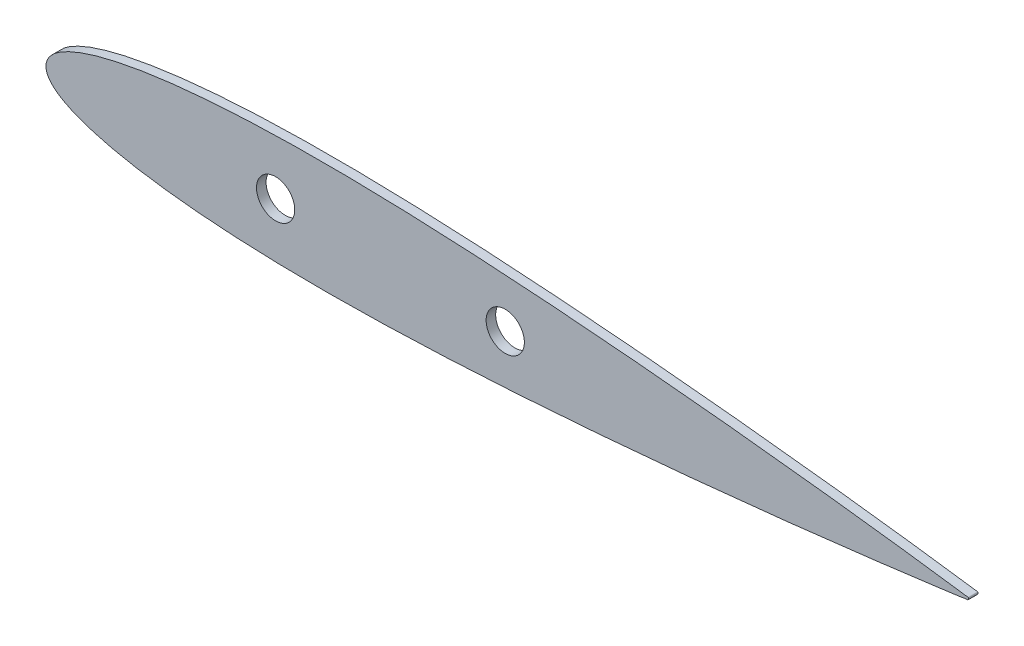
ISO-10303-21;
HEADER;
FILE_DESCRIPTION(('STEP AP214'),'2;1');
FILE_NAME('part.step','',(''),(''),'','','');
FILE_SCHEMA(('AUTOMOTIVE_DESIGN { 1 0 10303 214 1 1 1 1 }'));
ENDSEC;
DATA;
#1=APPLICATION_CONTEXT('core data for automotive mechanical design processes');
#2=APPLICATION_PROTOCOL_DEFINITION('international standard','automotive_design',2000,#1);
#3=PRODUCT_CONTEXT('',#1,'mechanical');
#4=PRODUCT('Part','Part','',(#3));
#5=PRODUCT_RELATED_PRODUCT_CATEGORY('part','',(#4));
#6=PRODUCT_DEFINITION_FORMATION('','',#4);
#7=PRODUCT_DEFINITION_CONTEXT('part definition',#1,'design');
#8=PRODUCT_DEFINITION('design','',#6,#7);
#9=PRODUCT_DEFINITION_SHAPE('','',#8);
#10=(LENGTH_UNIT() NAMED_UNIT(*) SI_UNIT(.MILLI.,.METRE.));
#11=(NAMED_UNIT(*) PLANE_ANGLE_UNIT() SI_UNIT($,.RADIAN.));
#12=(NAMED_UNIT(*) SI_UNIT($,.STERADIAN.) SOLID_ANGLE_UNIT());
#13=UNCERTAINTY_MEASURE_WITH_UNIT(LENGTH_MEASURE(1.E-05),#10,'distance_accuracy_value','');
#14=(GEOMETRIC_REPRESENTATION_CONTEXT(3) GLOBAL_UNCERTAINTY_ASSIGNED_CONTEXT((#13)) GLOBAL_UNIT_ASSIGNED_CONTEXT((#10,
#11,#12)) REPRESENTATION_CONTEXT('',''));
#15=CARTESIAN_POINT('',(0.,0.,0.));
#16=DIRECTION('',(0.,0.,1.));
#17=DIRECTION('',(1.,0.,0.));
#18=AXIS2_PLACEMENT_3D('',#15,#16,#17);
#19=CARTESIAN_POINT('',(305.9684,0.385520184,-3.175));
#20=CARTESIAN_POINT('',(305.854824007575,0.48069841410973,-3.175));
#21=CARTESIAN_POINT('',(305.120994555895,0.390831673606597,-3.175));
#22=CARTESIAN_POINT('',(303.814231768042,0.758686679799253,-3.175));
#23=CARTESIAN_POINT('',(301.417802676736,0.986054669025246,-3.175));
#24=CARTESIAN_POINT('',(298.189448712779,1.47401427677621,-3.175));
#25=CARTESIAN_POINT('',(294.030845174513,2.01854457527572,-3.175));
#26=CARTESIAN_POINT('',(289.015831822483,2.68965318276561,-3.175));
#27=CARTESIAN_POINT('',(283.157456272631,3.44827766150184,-3.175));
#28=CARTESIAN_POINT('',(276.49814160148,4.29290770175638,-3.175));
#29=CARTESIAN_POINT('',(269.076807577243,5.20874671807568,-3.175));
#30=CARTESIAN_POINT('',(260.939879406817,6.18340018350213,-3.175));
#31=CARTESIAN_POINT('',(252.137372075434,7.20477952206095,-3.175));
#32=CARTESIAN_POINT('',(242.723491759647,8.25897893790445,-3.175));
#33=CARTESIAN_POINT('',(232.756311129561,9.33312748999758,-3.175));
#34=CARTESIAN_POINT('',(222.297351640593,10.4138841228529,-3.175));
#35=CARTESIAN_POINT('',(211.411070811173,11.4872989231079,-3.175));
#36=CARTESIAN_POINT('',(200.164615863161,12.538304371789,-3.175));
#37=CARTESIAN_POINT('',(188.627247338619,13.5531029361085,-3.175));
#38=CARTESIAN_POINT('',(176.87022307814,14.514729000407,-3.175));
#39=CARTESIAN_POINT('',(164.965784853564,15.4075032133192,-3.175));
#40=CARTESIAN_POINT('',(152.987435637631,16.2148505092547,-3.175));
#41=CARTESIAN_POINT('',(141.008978817888,16.9198899528314,-3.175));
#42=CARTESIAN_POINT('',(129.104156498311,17.5048096113218,-3.175));
#43=CARTESIAN_POINT('',(117.346492481379,17.9540120579031,-3.175));
#44=CARTESIAN_POINT('',(105.808137483863,18.2528426223714,-3.175));
#45=CARTESIAN_POINT('',(94.5603961851285,18.386705288232,-3.175));
#46=CARTESIAN_POINT('',(83.6723813017294,18.3449766577127,-3.175));
#47=CARTESIAN_POINT('',(73.211220284293,18.1195965084667,-3.175));
#48=CARTESIAN_POINT('',(63.2413063542083,17.7048517000977,-3.175));
#49=CARTESIAN_POINT('',(53.8240062425347,17.0996573248404,-3.175));
#50=CARTESIAN_POINT('',(45.0171990186773,16.3058343725863,-3.175));
#51=CARTESIAN_POINT('',(36.8747760736251,15.3295826346004,-3.175));
#52=CARTESIAN_POINT('',(29.4463680844939,14.1792085683293,-3.175));
#53=CARTESIAN_POINT('',(22.7769894068164,12.8667268476887,-3.175));
#54=CARTESIAN_POINT('',(16.9057301867433,11.4069780538882,-3.175));
#55=CARTESIAN_POINT('',(11.8659534663283,9.8141965580124,-3.175));
#56=CARTESIAN_POINT('',(7.68326461790974,8.10321690756641,-3.175));
#57=CARTESIAN_POINT('',(4.37100235259373,6.28561468423618,-3.175));
#58=CARTESIAN_POINT('',(1.93426345252676,4.35780250182331,-3.175));
#59=CARTESIAN_POINT('',(0.373552012235147,2.27314220301764,-3.175));
#60=CARTESIAN_POINT('',(-0.17408851908788,0.,-3.175));
#61=CARTESIAN_POINT('',(0.37355201223512,-2.27314220301757,-3.175));
#62=CARTESIAN_POINT('',(1.9342634525268,-4.35780250182338,-3.175));
#63=CARTESIAN_POINT('',(4.37100235259372,-6.28561468423617,-3.175));
#64=CARTESIAN_POINT('',(7.6832646179097,-8.10321690756639,-3.175));
#65=CARTESIAN_POINT('',(11.8659534663283,-9.81419655801241,-3.175));
#66=CARTESIAN_POINT('',(16.9057301867433,-11.4069780538882,-3.175));
#67=CARTESIAN_POINT('',(22.7769894068164,-12.8667268476887,-3.175));
#68=CARTESIAN_POINT('',(29.4463680844939,-14.1792085683293,-3.175));
#69=CARTESIAN_POINT('',(36.8747760736251,-15.3295826346004,-3.175));
#70=CARTESIAN_POINT('',(45.0171990186774,-16.3058343725863,-3.175));
#71=CARTESIAN_POINT('',(53.8240062425346,-17.0996573248404,-3.175));
#72=CARTESIAN_POINT('',(63.2413063542084,-17.7048517000977,-3.175));
#73=CARTESIAN_POINT('',(73.211220284293,-18.1195965084667,-3.175));
#74=CARTESIAN_POINT('',(83.6723813017294,-18.3449766577127,-3.175));
#75=CARTESIAN_POINT('',(94.5603961851285,-18.386705288232,-3.175));
#76=CARTESIAN_POINT('',(105.808137483863,-18.2528426223714,-3.175));
#77=CARTESIAN_POINT('',(117.346492481379,-17.9540120579031,-3.175));
#78=CARTESIAN_POINT('',(129.104156498311,-17.5048096113217,-3.175));
#79=CARTESIAN_POINT('',(141.008978817888,-16.9198899528313,-3.175));
#80=CARTESIAN_POINT('',(152.987435637631,-16.2148505092547,-3.175));
#81=CARTESIAN_POINT('',(164.965784853564,-15.4075032133192,-3.175));
#82=CARTESIAN_POINT('',(176.87022307814,-14.514729000407,-3.175));
#83=CARTESIAN_POINT('',(188.627247338619,-13.5531029361085,-3.175));
#84=CARTESIAN_POINT('',(200.164615863161,-12.538304371789,-3.175));
#85=CARTESIAN_POINT('',(211.411070811174,-11.4872989231079,-3.175));
#86=CARTESIAN_POINT('',(222.297351640593,-10.4138841228529,-3.175));
#87=CARTESIAN_POINT('',(232.756311129561,-9.33312748999759,-3.175));
#88=CARTESIAN_POINT('',(242.723491759647,-8.25897893790443,-3.175));
#89=CARTESIAN_POINT('',(252.137372075434,-7.20477952206096,-3.175));
#90=CARTESIAN_POINT('',(260.939879406817,-6.18340018350213,-3.175));
#91=CARTESIAN_POINT('',(269.076807577243,-5.20874671807568,-3.175));
#92=CARTESIAN_POINT('',(276.49814160148,-4.2929077017564,-3.175));
#93=CARTESIAN_POINT('',(283.157456272631,-3.44827766150183,-3.175));
#94=CARTESIAN_POINT('',(289.015831822483,-2.6896531827656,-3.175));
#95=CARTESIAN_POINT('',(294.030845174512,-2.01854457527572,-3.175));
#96=CARTESIAN_POINT('',(298.189448712779,-1.47401427677621,-3.175));
#97=CARTESIAN_POINT('',(301.417802676736,-0.986054669025259,-3.175));
#98=CARTESIAN_POINT('',(303.814231768042,-0.758686679799237,-3.175));
#99=CARTESIAN_POINT('',(305.120994555895,-0.390831673606593,-3.175));
#100=CARTESIAN_POINT('',(306.152332879619,-0.517132155683031,-3.175));
#101=CARTESIAN_POINT('',(306.152332879619,0.231381923198419,-3.175));
#102=CARTESIAN_POINT('',(305.9684,0.385520184,-3.175));
#103=B_SPLINE_CURVE_WITH_KNOTS('',3,(#19,#20,#21,#22,#23,#24,#25,#26,#27,#28,#29,#30,#31,#32,
#33,#34,#35,#36,#37,#38,#39,#40,#41,#42,#43,#44,#45,#46,#47,#48,#49,#50,#51,#52,#53,#54,#55,#56,
#57,#58,#59,#60,#61,#62,#63,#64,#65,#66,#67,#68,#69,#70,#71,#72,#73,#74,#75,#76,#77,#78,#79,#80,
#81,#82,#83,#84,#85,#86,#87,#88,#89,#90,#91,#92,#93,#94,#95,#96,#97,#98,#99,#100,#101,#102),
.UNSPECIFIED.,.T.,.F.,(4,1,1,1,1,1,1,1,1,1,1,1,1,1,1,1,1,1,1,1,1,1,1,1,1,1,1,1,1,1,1,1,1,1,1,1,
1,1,1,1,1,1,1,1,1,1,1,1,1,1,1,1,1,1,1,1,1,1,1,1,1,1,1,1,1,1,1,1,1,1,1,1,1,1,1,1,1,1,1,1,1,4),
(0.,0.000762214812108456,0.00304470647190103,0.00683224554309418,0.0121011757231476,
0.0188175356586682,0.0269394547124811,0.0364148482585639,0.0471846285149192,0.0591804130191347,
0.0723278735332292,0.0865440610892471,0.101740580336648,0.117823336433666,0.134691452208409,
0.152240154447238,0.170361289964715,0.188941007849616,0.207865435445709,0.227016078022567,
0.246275695980061,0.265524943249952,0.284644966110495,0.303520118268709,0.322034575374374,
0.340078352914156,0.357542593241736,0.374325481920864,0.390329890871914,0.405463889739117,
0.419643801445704,0.432793371391356,0.444843816743199,0.455737920704744,0.465428653233093,
0.473886320085422,0.481101634077573,0.487101684418681,0.491975368345095,0.49593067780738,
0.499382808099288,0.502834938391197,0.506790247853482,0.511663931779896,0.517663982121004,
0.524879296113155,0.533336962965484,0.543027695493832,0.553921799455378,0.565972244807221,
0.579121814752873,0.59330172645946,0.608435725326663,0.624440134277712,0.641223022956841,
0.658687263284421,0.676731040824203,0.695245497929868,0.714120650088082,0.733240672948625,
0.752489920218516,0.77174953817601,0.790900180752868,0.80982460834896,0.828404326233861,
0.846525461751339,0.864074163990167,0.880942279764911,0.897025035861929,0.91222155510933,
0.926437742665347,0.939585203179442,0.951580987683658,0.962350767940013,0.971826161486095,
0.979948080539908,0.986664440475429,0.991933370655482,0.995720909726675,0.998003401386468,
0.998765616198577,1.),.UNSPECIFIED.);
#104=DIRECTION('',(0.,0.,1.));
#105=VECTOR('',#104,1.);
#106=SURFACE_OF_LINEAR_EXTRUSION('',#103,#105);
#107=CARTESIAN_POINT('',(305.9684,0.385520184,-3.175));
#108=VERTEX_POINT('',#107);
#109=EDGE_CURVE('E10',#108,#108,#103,.T.);
#110=ORIENTED_EDGE('',*,*,#109,.T.);
#111=EDGE_LOOP('',(#110));
#112=FACE_BOUND('',#111,.T.);
#113=CARTESIAN_POINT('',(305.9684,0.385520184,0.));
#114=CARTESIAN_POINT('',(305.854824007575,0.48069841410973,0.));
#115=CARTESIAN_POINT('',(305.120994555895,0.390831673606597,0.));
#116=CARTESIAN_POINT('',(303.814231768042,0.758686679799253,0.));
#117=CARTESIAN_POINT('',(301.417802676736,0.986054669025246,0.));
#118=CARTESIAN_POINT('',(298.189448712779,1.47401427677621,0.));
#119=CARTESIAN_POINT('',(294.030845174513,2.01854457527572,0.));
#120=CARTESIAN_POINT('',(289.015831822483,2.68965318276561,0.));
#121=CARTESIAN_POINT('',(283.157456272631,3.44827766150184,0.));
#122=CARTESIAN_POINT('',(276.49814160148,4.29290770175638,0.));
#123=CARTESIAN_POINT('',(269.076807577243,5.20874671807568,0.));
#124=CARTESIAN_POINT('',(260.939879406817,6.18340018350213,0.));
#125=CARTESIAN_POINT('',(252.137372075434,7.20477952206095,0.));
#126=CARTESIAN_POINT('',(242.723491759647,8.25897893790445,0.));
#127=CARTESIAN_POINT('',(232.756311129561,9.33312748999758,0.));
#128=CARTESIAN_POINT('',(222.297351640593,10.4138841228529,0.));
#129=CARTESIAN_POINT('',(211.411070811173,11.4872989231079,0.));
#130=CARTESIAN_POINT('',(200.164615863161,12.538304371789,0.));
#131=CARTESIAN_POINT('',(188.627247338619,13.5531029361085,0.));
#132=CARTESIAN_POINT('',(176.87022307814,14.514729000407,0.));
#133=CARTESIAN_POINT('',(164.965784853564,15.4075032133192,0.));
#134=CARTESIAN_POINT('',(152.987435637631,16.2148505092547,0.));
#135=CARTESIAN_POINT('',(141.008978817888,16.9198899528314,0.));
#136=CARTESIAN_POINT('',(129.104156498311,17.5048096113218,0.));
#137=CARTESIAN_POINT('',(117.346492481379,17.9540120579031,0.));
#138=CARTESIAN_POINT('',(105.808137483863,18.2528426223714,0.));
#139=CARTESIAN_POINT('',(94.5603961851285,18.386705288232,0.));
#140=CARTESIAN_POINT('',(83.6723813017294,18.3449766577127,0.));
#141=CARTESIAN_POINT('',(73.211220284293,18.1195965084667,0.));
#142=CARTESIAN_POINT('',(63.2413063542083,17.7048517000977,0.));
#143=CARTESIAN_POINT('',(53.8240062425347,17.0996573248404,0.));
#144=CARTESIAN_POINT('',(45.0171990186773,16.3058343725863,0.));
#145=CARTESIAN_POINT('',(36.8747760736251,15.3295826346004,0.));
#146=CARTESIAN_POINT('',(29.4463680844939,14.1792085683293,0.));
#147=CARTESIAN_POINT('',(22.7769894068164,12.8667268476887,0.));
#148=CARTESIAN_POINT('',(16.9057301867433,11.4069780538882,0.));
#149=CARTESIAN_POINT('',(11.8659534663283,9.8141965580124,0.));
#150=CARTESIAN_POINT('',(7.68326461790974,8.10321690756641,0.));
#151=CARTESIAN_POINT('',(4.37100235259373,6.28561468423618,0.));
#152=CARTESIAN_POINT('',(1.93426345252676,4.35780250182331,0.));
#153=CARTESIAN_POINT('',(0.373552012235147,2.27314220301764,0.));
#154=CARTESIAN_POINT('',(-0.17408851908788,0.,0.));
#155=CARTESIAN_POINT('',(0.37355201223512,-2.27314220301757,0.));
#156=CARTESIAN_POINT('',(1.9342634525268,-4.35780250182338,0.));
#157=CARTESIAN_POINT('',(4.37100235259372,-6.28561468423617,0.));
#158=CARTESIAN_POINT('',(7.6832646179097,-8.10321690756639,0.));
#159=CARTESIAN_POINT('',(11.8659534663283,-9.81419655801241,0.));
#160=CARTESIAN_POINT('',(16.9057301867433,-11.4069780538882,0.));
#161=CARTESIAN_POINT('',(22.7769894068164,-12.8667268476887,0.));
#162=CARTESIAN_POINT('',(29.4463680844939,-14.1792085683293,0.));
#163=CARTESIAN_POINT('',(36.8747760736251,-15.3295826346004,0.));
#164=CARTESIAN_POINT('',(45.0171990186774,-16.3058343725863,0.));
#165=CARTESIAN_POINT('',(53.8240062425346,-17.0996573248404,0.));
#166=CARTESIAN_POINT('',(63.2413063542084,-17.7048517000977,0.));
#167=CARTESIAN_POINT('',(73.211220284293,-18.1195965084667,0.));
#168=CARTESIAN_POINT('',(83.6723813017294,-18.3449766577127,0.));
#169=CARTESIAN_POINT('',(94.5603961851285,-18.386705288232,0.));
#170=CARTESIAN_POINT('',(105.808137483863,-18.2528426223714,0.));
#171=CARTESIAN_POINT('',(117.346492481379,-17.9540120579031,0.));
#172=CARTESIAN_POINT('',(129.104156498311,-17.5048096113217,0.));
#173=CARTESIAN_POINT('',(141.008978817888,-16.9198899528313,0.));
#174=CARTESIAN_POINT('',(152.987435637631,-16.2148505092547,0.));
#175=CARTESIAN_POINT('',(164.965784853564,-15.4075032133192,0.));
#176=CARTESIAN_POINT('',(176.87022307814,-14.514729000407,0.));
#177=CARTESIAN_POINT('',(188.627247338619,-13.5531029361085,0.));
#178=CARTESIAN_POINT('',(200.164615863161,-12.538304371789,0.));
#179=CARTESIAN_POINT('',(211.411070811174,-11.4872989231079,0.));
#180=CARTESIAN_POINT('',(222.297351640593,-10.4138841228529,0.));
#181=CARTESIAN_POINT('',(232.756311129561,-9.33312748999759,0.));
#182=CARTESIAN_POINT('',(242.723491759647,-8.25897893790443,0.));
#183=CARTESIAN_POINT('',(252.137372075434,-7.20477952206096,0.));
#184=CARTESIAN_POINT('',(260.939879406817,-6.18340018350213,0.));
#185=CARTESIAN_POINT('',(269.076807577243,-5.20874671807568,0.));
#186=CARTESIAN_POINT('',(276.49814160148,-4.2929077017564,0.));
#187=CARTESIAN_POINT('',(283.157456272631,-3.44827766150183,0.));
#188=CARTESIAN_POINT('',(289.015831822483,-2.6896531827656,0.));
#189=CARTESIAN_POINT('',(294.030845174512,-2.01854457527572,0.));
#190=CARTESIAN_POINT('',(298.189448712779,-1.47401427677621,0.));
#191=CARTESIAN_POINT('',(301.417802676736,-0.986054669025259,0.));
#192=CARTESIAN_POINT('',(303.814231768042,-0.758686679799237,0.));
#193=CARTESIAN_POINT('',(305.120994555895,-0.390831673606593,0.));
#194=CARTESIAN_POINT('',(306.152332879619,-0.517132155683031,0.));
#195=CARTESIAN_POINT('',(306.152332879619,0.231381923198419,0.));
#196=CARTESIAN_POINT('',(305.9684,0.385520184,0.));
#197=B_SPLINE_CURVE_WITH_KNOTS('',3,(#113,#114,#115,#116,#117,#118,#119,#120,#121,#122,#123,
#124,#125,#126,#127,#128,#129,#130,#131,#132,#133,#134,#135,#136,#137,#138,#139,#140,#141,#142,
#143,#144,#145,#146,#147,#148,#149,#150,#151,#152,#153,#154,#155,#156,#157,#158,#159,#160,#161,
#162,#163,#164,#165,#166,#167,#168,#169,#170,#171,#172,#173,#174,#175,#176,#177,#178,#179,#180,
#181,#182,#183,#184,#185,#186,#187,#188,#189,#190,#191,#192,#193,#194,#195,#196),.UNSPECIFIED.,
.T.,.F.,(4,1,1,1,1,1,1,1,1,1,1,1,1,1,1,1,1,1,1,1,1,1,1,1,1,1,1,1,1,1,1,1,1,1,1,1,1,1,1,1,1,1,1,
1,1,1,1,1,1,1,1,1,1,1,1,1,1,1,1,1,1,1,1,1,1,1,1,1,1,1,1,1,1,1,1,1,1,1,1,1,1,4),(0.,
0.000762214812108456,0.00304470647190103,0.00683224554309418,0.0121011757231476,
0.0188175356586682,0.0269394547124811,0.0364148482585639,0.0471846285149192,0.0591804130191347,
0.0723278735332292,0.0865440610892471,0.101740580336648,0.117823336433666,0.134691452208409,
0.152240154447238,0.170361289964715,0.188941007849616,0.207865435445709,0.227016078022567,
0.246275695980061,0.265524943249952,0.284644966110495,0.303520118268709,0.322034575374374,
0.340078352914156,0.357542593241736,0.374325481920864,0.390329890871914,0.405463889739117,
0.419643801445704,0.432793371391356,0.444843816743199,0.455737920704744,0.465428653233093,
0.473886320085422,0.481101634077573,0.487101684418681,0.491975368345095,0.49593067780738,
0.499382808099288,0.502834938391197,0.506790247853482,0.511663931779896,0.517663982121004,
0.524879296113155,0.533336962965484,0.543027695493832,0.553921799455378,0.565972244807221,
0.579121814752873,0.59330172645946,0.608435725326663,0.624440134277712,0.641223022956841,
0.658687263284421,0.676731040824203,0.695245497929868,0.714120650088082,0.733240672948625,
0.752489920218516,0.77174953817601,0.790900180752868,0.80982460834896,0.828404326233861,
0.846525461751339,0.864074163990167,0.880942279764911,0.897025035861929,0.91222155510933,
0.926437742665347,0.939585203179442,0.951580987683658,0.962350767940013,0.971826161486095,
0.979948080539908,0.986664440475429,0.991933370655482,0.995720909726675,0.998003401386468,
0.998765616198577,1.),.UNSPECIFIED.);
#198=CARTESIAN_POINT('',(305.9684,0.385520184,0.));
#199=VERTEX_POINT('',#198);
#200=EDGE_CURVE('E39',#199,#199,#197,.T.);
#201=ORIENTED_EDGE('',*,*,#200,.F.);
#202=EDGE_LOOP('',(#201));
#203=FACE_BOUND('',#202,.T.);
#204=ADVANCED_FACE('F35',(#112,#203),#106,.T.);
#205=CARTESIAN_POINT('',(0.0164037576888968,-0.387210857729466,-3.175));
#206=DIRECTION('',(0.,0.,1.));
#207=DIRECTION('',(-1.,0.,0.));
#208=AXIS2_PLACEMENT_3D('',#205,#206,#207);
#209=PLANE('',#208);
#210=CARTESIAN_POINT('',(76.2,0.,-3.175));
#211=DIRECTION('',(0.,0.,1.));
#212=DIRECTION('',(1.,0.,0.));
#213=AXIS2_PLACEMENT_3D('',#210,#211,#212);
#214=CIRCLE('',#213,6.35);
#215=CARTESIAN_POINT('',(82.55,0.,-3.175));
#216=VERTEX_POINT('',#215);
#217=EDGE_CURVE('E61',#216,#216,#214,.T.);
#218=ORIENTED_EDGE('',*,*,#217,.T.);
#219=EDGE_LOOP('',(#218));
#220=FACE_BOUND('',#219,.T.);
#221=CARTESIAN_POINT('',(152.4,0.,-3.175));
#222=DIRECTION('',(0.,0.,1.));
#223=DIRECTION('',(1.,0.,0.));
#224=AXIS2_PLACEMENT_3D('',#221,#222,#223);
#225=CIRCLE('',#224,6.35);
#226=CARTESIAN_POINT('',(158.75,0.,-3.175));
#227=VERTEX_POINT('',#226);
#228=EDGE_CURVE('E52',#227,#227,#225,.T.);
#229=ORIENTED_EDGE('',*,*,#228,.T.);
#230=EDGE_LOOP('',(#229));
#231=FACE_BOUND('',#230,.T.);
#232=ORIENTED_EDGE('',*,*,#109,.F.);
#233=EDGE_LOOP('',(#232));
#234=FACE_BOUND('',#233,.T.);
#235=ADVANCED_FACE('F74',(#220,#231,#234),#209,.F.);
#236=CARTESIAN_POINT('',(0.0164037576888968,-0.387210857729466,0.));
#237=DIRECTION('',(0.,0.,1.));
#238=DIRECTION('',(-1.,0.,0.));
#239=AXIS2_PLACEMENT_3D('',#236,#237,#238);
#240=PLANE('',#239);
#241=CARTESIAN_POINT('',(76.2,0.,0.));
#242=DIRECTION('',(0.,0.,1.));
#243=DIRECTION('',(1.,0.,0.));
#244=AXIS2_PLACEMENT_3D('',#241,#242,#243);
#245=CIRCLE('',#244,6.35);
#246=CARTESIAN_POINT('',(82.55,0.,0.));
#247=VERTEX_POINT('',#246);
#248=EDGE_CURVE('E47',#247,#247,#245,.T.);
#249=ORIENTED_EDGE('',*,*,#248,.F.);
#250=EDGE_LOOP('',(#249));
#251=FACE_BOUND('',#250,.T.);
#252=CARTESIAN_POINT('',(152.4,0.,0.));
#253=DIRECTION('',(0.,0.,1.));
#254=DIRECTION('',(1.,0.,0.));
#255=AXIS2_PLACEMENT_3D('',#252,#253,#254);
#256=CIRCLE('',#255,6.35);
#257=CARTESIAN_POINT('',(158.75,0.,0.));
#258=VERTEX_POINT('',#257);
#259=EDGE_CURVE('E58',#258,#258,#256,.T.);
#260=ORIENTED_EDGE('',*,*,#259,.F.);
#261=EDGE_LOOP('',(#260));
#262=FACE_BOUND('',#261,.T.);
#263=ORIENTED_EDGE('',*,*,#200,.T.);
#264=EDGE_LOOP('',(#263));
#265=FACE_BOUND('',#264,.T.);
#266=ADVANCED_FACE('F70',(#251,#262,#265),#240,.T.);
#267=CARTESIAN_POINT('',(152.4,0.,0.));
#268=DIRECTION('',(0.,0.,-1.));
#269=DIRECTION('',(1.,0.,0.));
#270=AXIS2_PLACEMENT_3D('',#267,#268,#269);
#271=CYLINDRICAL_SURFACE('',#270,6.35);
#272=ORIENTED_EDGE('',*,*,#259,.T.);
#273=EDGE_LOOP('',(#272));
#274=FACE_BOUND('',#273,.T.);
#275=ORIENTED_EDGE('',*,*,#228,.F.);
#276=EDGE_LOOP('',(#275));
#277=FACE_BOUND('',#276,.T.);
#278=ADVANCED_FACE('F73',(#274,#277),#271,.F.);
#279=CARTESIAN_POINT('',(76.2,0.,0.));
#280=DIRECTION('',(0.,0.,-1.));
#281=DIRECTION('',(1.,0.,0.));
#282=AXIS2_PLACEMENT_3D('',#279,#280,#281);
#283=CYLINDRICAL_SURFACE('',#282,6.35);
#284=ORIENTED_EDGE('',*,*,#248,.T.);
#285=EDGE_LOOP('',(#284));
#286=FACE_BOUND('',#285,.T.);
#287=ORIENTED_EDGE('',*,*,#217,.F.);
#288=EDGE_LOOP('',(#287));
#289=FACE_BOUND('',#288,.T.);
#290=ADVANCED_FACE('F67',(#286,#289),#283,.F.);
#291=CLOSED_SHELL('',(#204,#235,#266,#278,#290));
#292=MANIFOLD_SOLID_BREP('B2',#291);
#293=ADVANCED_BREP_SHAPE_REPRESENTATION('',(#18,#292),#14);
#294=SHAPE_DEFINITION_REPRESENTATION(#9,#293);
ENDSEC;
END-ISO-10303-21;
